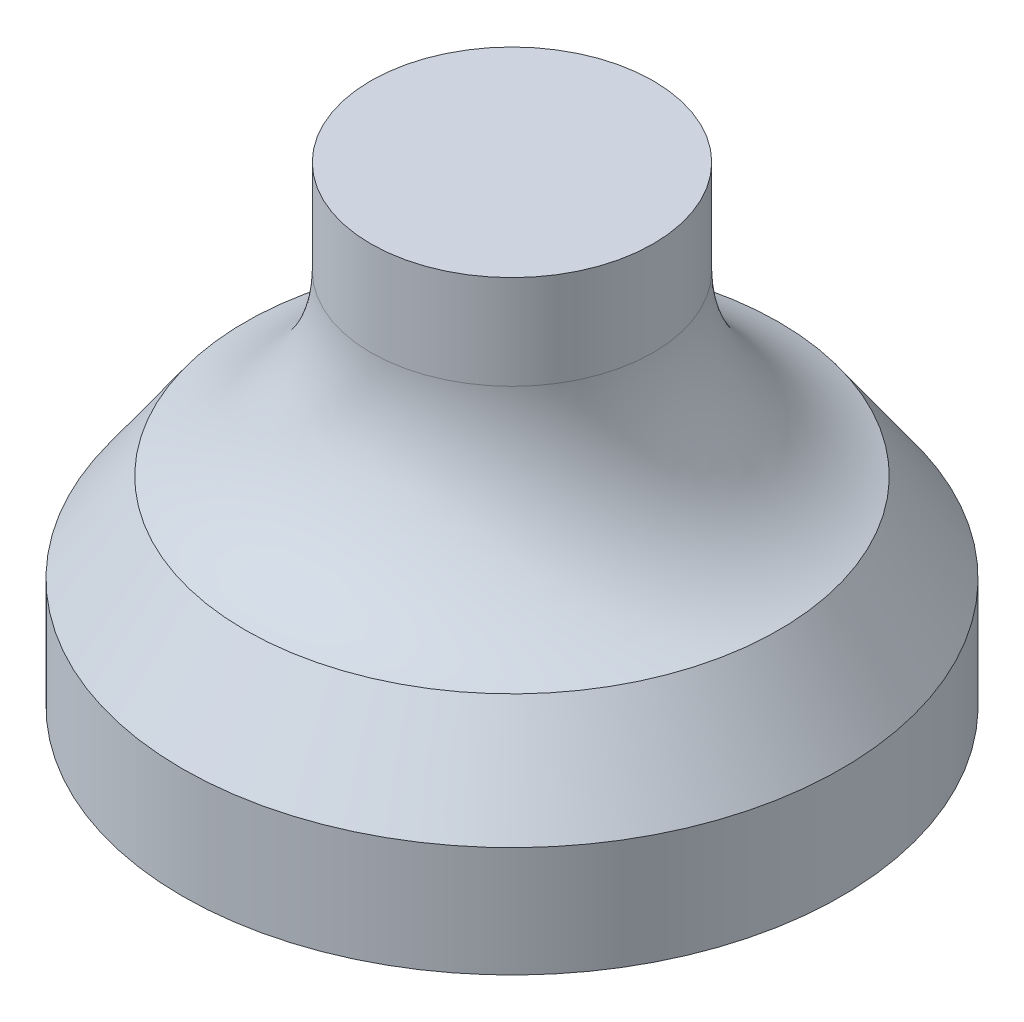
ISO-10303-21;
HEADER;
FILE_DESCRIPTION(('STEP AP214'),'2;1');
FILE_NAME('part.step','',(''),(''),'','','');
FILE_SCHEMA(('AUTOMOTIVE_DESIGN { 1 0 10303 214 1 1 1 1 }'));
ENDSEC;
DATA;
#1=APPLICATION_CONTEXT('core data for automotive mechanical design processes');
#2=APPLICATION_PROTOCOL_DEFINITION('international standard','automotive_design',2000,#1);
#3=PRODUCT_CONTEXT('',#1,'mechanical');
#4=PRODUCT('Part','Part','',(#3));
#5=PRODUCT_RELATED_PRODUCT_CATEGORY('part','',(#4));
#6=PRODUCT_DEFINITION_FORMATION('','',#4);
#7=PRODUCT_DEFINITION_CONTEXT('part definition',#1,'design');
#8=PRODUCT_DEFINITION('design','',#6,#7);
#9=PRODUCT_DEFINITION_SHAPE('','',#8);
#10=(LENGTH_UNIT() NAMED_UNIT(*) SI_UNIT(.MILLI.,.METRE.));
#11=(NAMED_UNIT(*) PLANE_ANGLE_UNIT() SI_UNIT($,.RADIAN.));
#12=(NAMED_UNIT(*) SI_UNIT($,.STERADIAN.) SOLID_ANGLE_UNIT());
#13=UNCERTAINTY_MEASURE_WITH_UNIT(LENGTH_MEASURE(1.E-05),#10,'distance_accuracy_value','');
#14=(GEOMETRIC_REPRESENTATION_CONTEXT(3) GLOBAL_UNCERTAINTY_ASSIGNED_CONTEXT((#13)) GLOBAL_UNIT_ASSIGNED_CONTEXT((#10,
#11,#12)) REPRESENTATION_CONTEXT('',''));
#15=CARTESIAN_POINT('',(0.,0.,0.));
#16=DIRECTION('',(0.,0.,1.));
#17=DIRECTION('',(1.,0.,0.));
#18=AXIS2_PLACEMENT_3D('',#15,#16,#17);
#19=CARTESIAN_POINT('',(0.,20.,0.));
#20=DIRECTION('',(0.,-1.,0.));
#21=DIRECTION('',(0.,0.,-1.));
#22=AXIS2_PLACEMENT_3D('',#19,#20,#21);
#23=CYLINDRICAL_SURFACE('',#22,35.);
#24=CARTESIAN_POINT('',(0.,11.7157287525381,0.));
#25=DIRECTION('',(0.,-1.,0.));
#26=DIRECTION('',(0.,0.,-1.));
#27=AXIS2_PLACEMENT_3D('',#24,#25,#26);
#28=CIRCLE('',#27,35.);
#29=CARTESIAN_POINT('',(0.,11.7157287525381,-35.));
#30=VERTEX_POINT('',#29);
#31=EDGE_CURVE('E10',#30,#30,#28,.T.);
#32=ORIENTED_EDGE('',*,*,#31,.T.);
#33=EDGE_LOOP('',(#32));
#34=FACE_BOUND('',#33,.T.);
#35=CARTESIAN_POINT('',(0.,0.,0.));
#36=DIRECTION('',(0.,1.,0.));
#37=DIRECTION('',(0.,0.,1.));
#38=AXIS2_PLACEMENT_3D('',#35,#36,#37);
#39=CIRCLE('',#38,35.);
#40=CARTESIAN_POINT('',(0.,0.,35.));
#41=VERTEX_POINT('',#40);
#42=EDGE_CURVE('E58',#41,#41,#39,.T.);
#43=ORIENTED_EDGE('',*,*,#42,.T.);
#44=EDGE_LOOP('',(#43));
#45=FACE_BOUND('',#44,.T.);
#46=ADVANCED_FACE('F39',(#34,#45),#23,.T.);
#47=CARTESIAN_POINT('',(0.,0.,0.));
#48=DIRECTION('',(0.,1.,0.));
#49=DIRECTION('',(0.,0.,1.));
#50=AXIS2_PLACEMENT_3D('',#47,#48,#49);
#51=PLANE('',#50);
#52=ORIENTED_EDGE('',*,*,#42,.F.);
#53=EDGE_LOOP('',(#52));
#54=FACE_BOUND('',#53,.T.);
#55=ADVANCED_FACE('F73',(#54),#51,.F.);
#56=CARTESIAN_POINT('',(0.,50.,0.));
#57=DIRECTION('',(0.,-1.,0.));
#58=DIRECTION('',(0.,0.,-1.));
#59=AXIS2_PLACEMENT_3D('',#56,#57,#58);
#60=CYLINDRICAL_SURFACE('',#59,15.);
#61=CARTESIAN_POINT('',(0.,40.,0.));
#62=DIRECTION('',(0.,1.,0.));
#63=DIRECTION('',(0.,0.,1.));
#64=AXIS2_PLACEMENT_3D('',#61,#62,#63);
#65=CIRCLE('',#64,15.);
#66=CARTESIAN_POINT('',(0.,40.,15.));
#67=VERTEX_POINT('',#66);
#68=EDGE_CURVE('E53',#67,#67,#65,.T.);
#69=ORIENTED_EDGE('',*,*,#68,.T.);
#70=EDGE_LOOP('',(#69));
#71=FACE_BOUND('',#70,.T.);
#72=CARTESIAN_POINT('',(0.,50.,0.));
#73=DIRECTION('',(0.,1.,0.));
#74=DIRECTION('',(0.,0.,1.));
#75=AXIS2_PLACEMENT_3D('',#72,#73,#74);
#76=CIRCLE('',#75,15.);
#77=CARTESIAN_POINT('',(0.,50.,15.));
#78=VERTEX_POINT('',#77);
#79=EDGE_CURVE('E64',#78,#78,#76,.T.);
#80=ORIENTED_EDGE('',*,*,#79,.F.);
#81=EDGE_LOOP('',(#80));
#82=FACE_BOUND('',#81,.T.);
#83=ADVANCED_FACE('F71',(#71,#82),#60,.T.);
#84=CARTESIAN_POINT('',(0.,50.,0.));
#85=DIRECTION('',(0.,1.,0.));
#86=DIRECTION('',(0.,0.,1.));
#87=AXIS2_PLACEMENT_3D('',#84,#85,#86);
#88=PLANE('',#87);
#89=ORIENTED_EDGE('',*,*,#79,.T.);
#90=EDGE_LOOP('',(#89));
#91=FACE_BOUND('',#90,.T.);
#92=ADVANCED_FACE('F69',(#91),#88,.T.);
#93=CARTESIAN_POINT('',(0.,40.,0.));
#94=DIRECTION('',(0.,1.,0.));
#95=DIRECTION('',(0.,0.,1.));
#96=AXIS2_PLACEMENT_3D('',#93,#94,#95);
#97=TOROIDAL_SURFACE('',#96,35.,20.);
#98=CARTESIAN_POINT('',(0.,21.1438191683589,0.));
#99=DIRECTION('',(0.,1.,0.));
#100=DIRECTION('',(0.,0.,1.));
#101=AXIS2_PLACEMENT_3D('',#98,#99,#100);
#102=CIRCLE('',#101,28.3333333333333);
#103=CARTESIAN_POINT('',(0.,21.1438191683589,28.3333333333333));
#104=VERTEX_POINT('',#103);
#105=EDGE_CURVE('E48',#104,#104,#102,.T.);
#106=ORIENTED_EDGE('',*,*,#105,.T.);
#107=EDGE_LOOP('',(#106));
#108=FACE_BOUND('',#107,.T.);
#109=ORIENTED_EDGE('',*,*,#68,.F.);
#110=EDGE_LOOP('',(#109));
#111=FACE_BOUND('',#110,.T.);
#112=ADVANCED_FACE('F80',(#108,#111),#97,.F.);
#113=CARTESIAN_POINT('',(0.,21.1438191683588,0.));
#114=DIRECTION('',(0.,-1.,0.));
#115=DIRECTION('',(0.,0.,-1.));
#116=AXIS2_PLACEMENT_3D('',#113,#114,#115);
#117=CONICAL_SURFACE('',#116,28.3333333333332,0.615479708670392);
#118=ORIENTED_EDGE('',*,*,#31,.F.);
#119=EDGE_LOOP('',(#118));
#120=FACE_BOUND('',#119,.T.);
#121=ORIENTED_EDGE('',*,*,#105,.F.);
#122=EDGE_LOOP('',(#121));
#123=FACE_BOUND('',#122,.T.);
#124=ADVANCED_FACE('F42',(#120,#123),#117,.T.);
#125=CLOSED_SHELL('',(#46,#55,#83,#92,#112,#124));
#126=MANIFOLD_SOLID_BREP('B2',#125);
#127=ADVANCED_BREP_SHAPE_REPRESENTATION('',(#18,#126),#14);
#128=SHAPE_DEFINITION_REPRESENTATION(#9,#127);
ENDSEC;
END-ISO-10303-21;
